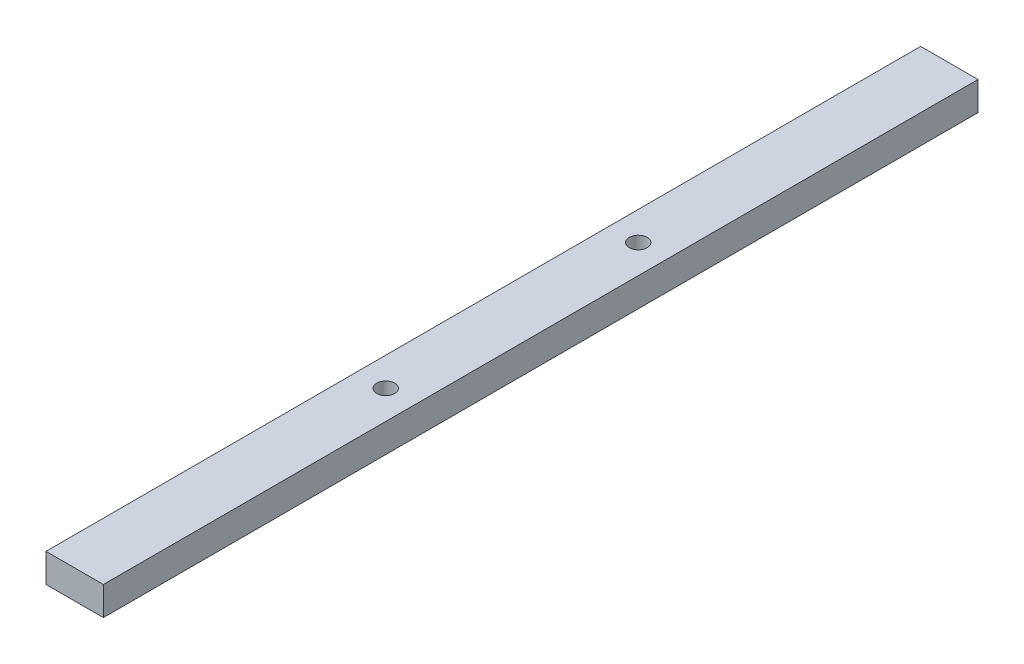
ISO-10303-21;
HEADER;
FILE_DESCRIPTION(('STEP AP214'),'2;1');
FILE_NAME('part.step','',(''),(''),'','','');
FILE_SCHEMA(('AUTOMOTIVE_DESIGN { 1 0 10303 214 1 1 1 1 }'));
ENDSEC;
DATA;
#1=APPLICATION_CONTEXT('core data for automotive mechanical design processes');
#2=APPLICATION_PROTOCOL_DEFINITION('international standard','automotive_design',2000,#1);
#3=PRODUCT_CONTEXT('',#1,'mechanical');
#4=PRODUCT('Part','Part','',(#3));
#5=PRODUCT_RELATED_PRODUCT_CATEGORY('part','',(#4));
#6=PRODUCT_DEFINITION_FORMATION('','',#4);
#7=PRODUCT_DEFINITION_CONTEXT('part definition',#1,'design');
#8=PRODUCT_DEFINITION('design','',#6,#7);
#9=PRODUCT_DEFINITION_SHAPE('','',#8);
#10=(LENGTH_UNIT() NAMED_UNIT(*) SI_UNIT(.MILLI.,.METRE.));
#11=(NAMED_UNIT(*) PLANE_ANGLE_UNIT() SI_UNIT($,.RADIAN.));
#12=(NAMED_UNIT(*) SI_UNIT($,.STERADIAN.) SOLID_ANGLE_UNIT());
#13=UNCERTAINTY_MEASURE_WITH_UNIT(LENGTH_MEASURE(1.E-05),#10,'distance_accuracy_value','');
#14=(GEOMETRIC_REPRESENTATION_CONTEXT(3) GLOBAL_UNCERTAINTY_ASSIGNED_CONTEXT((#13)) GLOBAL_UNIT_ASSIGNED_CONTEXT((#10,
#11,#12)) REPRESENTATION_CONTEXT('',''));
#15=CARTESIAN_POINT('',(0.,0.,0.));
#16=DIRECTION('',(0.,0.,1.));
#17=DIRECTION('',(1.,0.,0.));
#18=AXIS2_PLACEMENT_3D('',#15,#16,#17);
#19=CARTESIAN_POINT('',(-10.,-5.,152.4));
#20=DIRECTION('',(1.,0.,0.));
#21=DIRECTION('',(0.,1.,0.));
#22=AXIS2_PLACEMENT_3D('',#19,#20,#21);
#23=PLANE('',#22);
#24=DIRECTION('',(0.,-1.,0.));
#25=VECTOR('',#24,1.);
#26=CARTESIAN_POINT('',(-10.,-5.,-152.4));
#27=LINE('',#26,#25);
#28=CARTESIAN_POINT('',(-10.,5.,-152.4));
#29=VERTEX_POINT('',#28);
#30=CARTESIAN_POINT('',(-10.,-5.,-152.4));
#31=VERTEX_POINT('',#30);
#32=EDGE_CURVE('E117',#29,#31,#27,.T.);
#33=ORIENTED_EDGE('',*,*,#32,.T.);
#34=DIRECTION('',(0.,0.,-1.));
#35=VECTOR('',#34,1.);
#36=CARTESIAN_POINT('',(-10.,-5.,152.4));
#37=LINE('',#36,#35);
#38=CARTESIAN_POINT('',(-10.,-5.,152.4));
#39=VERTEX_POINT('',#38);
#40=EDGE_CURVE('E11',#39,#31,#37,.T.);
#41=ORIENTED_EDGE('',*,*,#40,.F.);
#42=DIRECTION('',(0.,-1.,0.));
#43=VECTOR('',#42,1.);
#44=CARTESIAN_POINT('',(-10.,-5.,152.4));
#45=LINE('',#44,#43);
#46=CARTESIAN_POINT('',(-10.,5.,152.4));
#47=VERTEX_POINT('',#46);
#48=EDGE_CURVE('E101',#47,#39,#45,.T.);
#49=ORIENTED_EDGE('',*,*,#48,.F.);
#50=DIRECTION('',(0.,0.,-1.));
#51=VECTOR('',#50,1.);
#52=CARTESIAN_POINT('',(-10.,5.,152.4));
#53=LINE('',#52,#51);
#54=EDGE_CURVE('E113',#47,#29,#53,.T.);
#55=ORIENTED_EDGE('',*,*,#54,.T.);
#56=EDGE_LOOP('',(#33,#41,#49,#55));
#57=FACE_BOUND('',#56,.T.);
#58=ADVANCED_FACE('F49',(#57),#23,.F.);
#59=CARTESIAN_POINT('',(10.,-5.,152.4));
#60=DIRECTION('',(0.,1.,0.));
#61=DIRECTION('',(-1.,0.,0.));
#62=AXIS2_PLACEMENT_3D('',#59,#60,#61);
#63=PLANE('',#62);
#64=CARTESIAN_POINT('',(0.,-5.,44.));
#65=DIRECTION('',(0.,1.,0.));
#66=DIRECTION('',(0.,0.,1.));
#67=AXIS2_PLACEMENT_3D('',#64,#65,#66);
#68=CIRCLE('',#67,3.125);
#69=CARTESIAN_POINT('',(0.,-5.,47.125));
#70=VERTEX_POINT('',#69);
#71=EDGE_CURVE('E146',#70,#70,#68,.T.);
#72=ORIENTED_EDGE('',*,*,#71,.T.);
#73=EDGE_LOOP('',(#72));
#74=FACE_BOUND('',#73,.T.);
#75=CARTESIAN_POINT('',(0.,-5.,-44.));
#76=DIRECTION('',(0.,1.,0.));
#77=DIRECTION('',(0.,0.,-1.));
#78=AXIS2_PLACEMENT_3D('',#75,#76,#77);
#79=CIRCLE('',#78,3.125);
#80=CARTESIAN_POINT('',(0.,-5.,-47.125));
#81=VERTEX_POINT('',#80);
#82=EDGE_CURVE('E142',#81,#81,#79,.T.);
#83=ORIENTED_EDGE('',*,*,#82,.T.);
#84=EDGE_LOOP('',(#83));
#85=FACE_BOUND('',#84,.T.);
#86=DIRECTION('',(1.,0.,0.));
#87=VECTOR('',#86,1.);
#88=CARTESIAN_POINT('',(10.,-5.,-152.4));
#89=LINE('',#88,#87);
#90=CARTESIAN_POINT('',(10.,-5.,-152.4));
#91=VERTEX_POINT('',#90);
#92=EDGE_CURVE('E106',#31,#91,#89,.T.);
#93=ORIENTED_EDGE('',*,*,#92,.T.);
#94=DIRECTION('',(0.,0.,-1.));
#95=VECTOR('',#94,1.);
#96=CARTESIAN_POINT('',(10.,-5.,152.4));
#97=LINE('',#96,#95);
#98=CARTESIAN_POINT('',(10.,-5.,152.4));
#99=VERTEX_POINT('',#98);
#100=EDGE_CURVE('E58',#99,#91,#97,.T.);
#101=ORIENTED_EDGE('',*,*,#100,.F.);
#102=DIRECTION('',(1.,0.,0.));
#103=VECTOR('',#102,1.);
#104=CARTESIAN_POINT('',(10.,-5.,152.4));
#105=LINE('',#104,#103);
#106=EDGE_CURVE('E96',#39,#99,#105,.T.);
#107=ORIENTED_EDGE('',*,*,#106,.F.);
#108=ORIENTED_EDGE('',*,*,#40,.T.);
#109=EDGE_LOOP('',(#93,#101,#107,#108));
#110=FACE_BOUND('',#109,.T.);
#111=ADVANCED_FACE('F105',(#74,#85,#110),#63,.F.);
#112=CARTESIAN_POINT('',(10.,5.,152.4));
#113=DIRECTION('',(-1.,0.,0.));
#114=DIRECTION('',(0.,-1.,0.));
#115=AXIS2_PLACEMENT_3D('',#112,#113,#114);
#116=PLANE('',#115);
#117=DIRECTION('',(0.,1.,0.));
#118=VECTOR('',#117,1.);
#119=CARTESIAN_POINT('',(10.,5.,-152.4));
#120=LINE('',#119,#118);
#121=CARTESIAN_POINT('',(10.,5.,-152.4));
#122=VERTEX_POINT('',#121);
#123=EDGE_CURVE('E83',#91,#122,#120,.T.);
#124=ORIENTED_EDGE('',*,*,#123,.T.);
#125=DIRECTION('',(0.,0.,-1.));
#126=VECTOR('',#125,1.);
#127=CARTESIAN_POINT('',(10.,5.,152.4));
#128=LINE('',#127,#126);
#129=CARTESIAN_POINT('',(10.,5.,152.4));
#130=VERTEX_POINT('',#129);
#131=EDGE_CURVE('E108',#130,#122,#128,.T.);
#132=ORIENTED_EDGE('',*,*,#131,.F.);
#133=DIRECTION('',(0.,1.,0.));
#134=VECTOR('',#133,1.);
#135=CARTESIAN_POINT('',(10.,5.,152.4));
#136=LINE('',#135,#134);
#137=EDGE_CURVE('E99',#99,#130,#136,.T.);
#138=ORIENTED_EDGE('',*,*,#137,.F.);
#139=ORIENTED_EDGE('',*,*,#100,.T.);
#140=EDGE_LOOP('',(#124,#132,#138,#139));
#141=FACE_BOUND('',#140,.T.);
#142=ADVANCED_FACE('F109',(#141),#116,.F.);
#143=CARTESIAN_POINT('',(-10.,5.,152.4));
#144=DIRECTION('',(0.,-1.,0.));
#145=DIRECTION('',(1.,0.,0.));
#146=AXIS2_PLACEMENT_3D('',#143,#144,#145);
#147=PLANE('',#146);
#148=CARTESIAN_POINT('',(0.,5.,44.));
#149=DIRECTION('',(0.,1.,0.));
#150=DIRECTION('',(0.,0.,1.));
#151=AXIS2_PLACEMENT_3D('',#148,#149,#150);
#152=CIRCLE('',#151,3.125);
#153=CARTESIAN_POINT('',(0.,5.,47.125));
#154=VERTEX_POINT('',#153);
#155=EDGE_CURVE('E121',#154,#154,#152,.T.);
#156=ORIENTED_EDGE('',*,*,#155,.F.);
#157=EDGE_LOOP('',(#156));
#158=FACE_BOUND('',#157,.T.);
#159=CARTESIAN_POINT('',(0.,5.,-44.));
#160=DIRECTION('',(0.,1.,0.));
#161=DIRECTION('',(0.,0.,-1.));
#162=AXIS2_PLACEMENT_3D('',#159,#160,#161);
#163=CIRCLE('',#162,3.125);
#164=CARTESIAN_POINT('',(0.,5.,-47.125));
#165=VERTEX_POINT('',#164);
#166=EDGE_CURVE('E138',#165,#165,#163,.T.);
#167=ORIENTED_EDGE('',*,*,#166,.F.);
#168=EDGE_LOOP('',(#167));
#169=FACE_BOUND('',#168,.T.);
#170=DIRECTION('',(-1.,0.,0.));
#171=VECTOR('',#170,1.);
#172=CARTESIAN_POINT('',(-10.,5.,-152.4));
#173=LINE('',#172,#171);
#174=EDGE_CURVE('E89',#122,#29,#173,.T.);
#175=ORIENTED_EDGE('',*,*,#174,.T.);
#176=ORIENTED_EDGE('',*,*,#54,.F.);
#177=DIRECTION('',(-1.,0.,0.));
#178=VECTOR('',#177,1.);
#179=CARTESIAN_POINT('',(-10.,5.,152.4));
#180=LINE('',#179,#178);
#181=EDGE_CURVE('E66',#130,#47,#180,.T.);
#182=ORIENTED_EDGE('',*,*,#181,.F.);
#183=ORIENTED_EDGE('',*,*,#131,.T.);
#184=EDGE_LOOP('',(#175,#176,#182,#183));
#185=FACE_BOUND('',#184,.T.);
#186=ADVANCED_FACE('F131',(#158,#169,#185),#147,.F.);
#187=CARTESIAN_POINT('',(0.,0.,152.4));
#188=DIRECTION('',(0.,0.,-1.));
#189=DIRECTION('',(-1.,0.,0.));
#190=AXIS2_PLACEMENT_3D('',#187,#188,#189);
#191=PLANE('',#190);
#192=ORIENTED_EDGE('',*,*,#48,.T.);
#193=ORIENTED_EDGE('',*,*,#106,.T.);
#194=ORIENTED_EDGE('',*,*,#137,.T.);
#195=ORIENTED_EDGE('',*,*,#181,.T.);
#196=EDGE_LOOP('',(#192,#193,#194,#195));
#197=FACE_BOUND('',#196,.T.);
#198=ADVANCED_FACE('F97',(#197),#191,.F.);
#199=CARTESIAN_POINT('',(0.,0.,-152.4));
#200=DIRECTION('',(0.,0.,-1.));
#201=DIRECTION('',(-1.,0.,0.));
#202=AXIS2_PLACEMENT_3D('',#199,#200,#201);
#203=PLANE('',#202);
#204=ORIENTED_EDGE('',*,*,#32,.F.);
#205=ORIENTED_EDGE('',*,*,#174,.F.);
#206=ORIENTED_EDGE('',*,*,#123,.F.);
#207=ORIENTED_EDGE('',*,*,#92,.F.);
#208=EDGE_LOOP('',(#204,#205,#206,#207));
#209=FACE_BOUND('',#208,.T.);
#210=ADVANCED_FACE('F134',(#209),#203,.T.);
#211=CARTESIAN_POINT('',(0.,5.,-44.));
#212=DIRECTION('',(0.,-1.,0.));
#213=DIRECTION('',(0.,0.,-1.));
#214=AXIS2_PLACEMENT_3D('',#211,#212,#213);
#215=CYLINDRICAL_SURFACE('',#214,3.125);
#216=ORIENTED_EDGE('',*,*,#166,.T.);
#217=EDGE_LOOP('',(#216));
#218=FACE_BOUND('',#217,.T.);
#219=ORIENTED_EDGE('',*,*,#82,.F.);
#220=EDGE_LOOP('',(#219));
#221=FACE_BOUND('',#220,.T.);
#222=ADVANCED_FACE('F162',(#218,#221),#215,.F.);
#223=CARTESIAN_POINT('',(0.,5.,44.));
#224=DIRECTION('',(0.,-1.,0.));
#225=DIRECTION('',(0.,0.,-1.));
#226=AXIS2_PLACEMENT_3D('',#223,#224,#225);
#227=CYLINDRICAL_SURFACE('',#226,3.125);
#228=ORIENTED_EDGE('',*,*,#155,.T.);
#229=EDGE_LOOP('',(#228));
#230=FACE_BOUND('',#229,.T.);
#231=ORIENTED_EDGE('',*,*,#71,.F.);
#232=EDGE_LOOP('',(#231));
#233=FACE_BOUND('',#232,.T.);
#234=ADVANCED_FACE('F154',(#230,#233),#227,.F.);
#235=CLOSED_SHELL('',(#58,#111,#142,#186,#198,#210,#222,#234));
#236=MANIFOLD_SOLID_BREP('B2',#235);
#237=ADVANCED_BREP_SHAPE_REPRESENTATION('',(#18,#236),#14);
#238=SHAPE_DEFINITION_REPRESENTATION(#9,#237);
ENDSEC;
END-ISO-10303-21;
